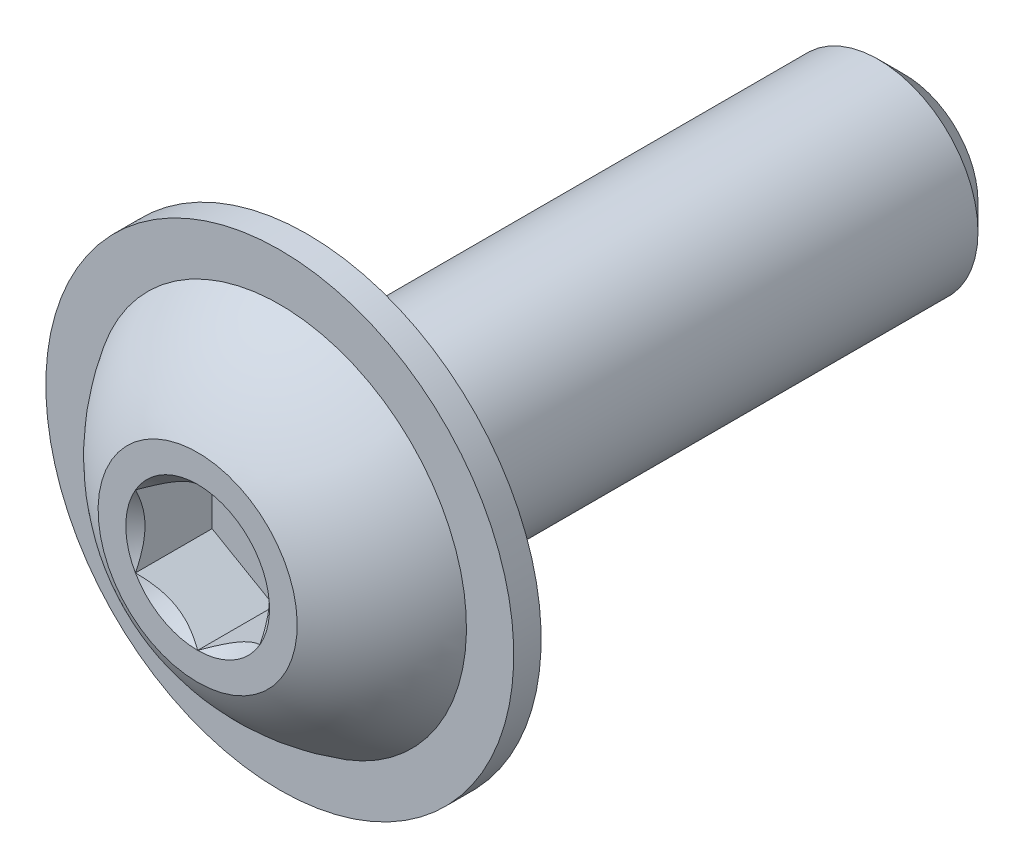
ISO-10303-21;
HEADER;
FILE_DESCRIPTION(('STEP AP214'),'2;1');
FILE_NAME('part.step','',(''),(''),'','','');
FILE_SCHEMA(('AUTOMOTIVE_DESIGN { 1 0 10303 214 1 1 1 1 }'));
ENDSEC;
DATA;
#1=APPLICATION_CONTEXT('core data for automotive mechanical design processes');
#2=APPLICATION_PROTOCOL_DEFINITION('international standard','automotive_design',2000,#1);
#3=PRODUCT_CONTEXT('',#1,'mechanical');
#4=PRODUCT('Part','Part','',(#3));
#5=PRODUCT_RELATED_PRODUCT_CATEGORY('part','',(#4));
#6=PRODUCT_DEFINITION_FORMATION('','',#4);
#7=PRODUCT_DEFINITION_CONTEXT('part definition',#1,'design');
#8=PRODUCT_DEFINITION('design','',#6,#7);
#9=PRODUCT_DEFINITION_SHAPE('','',#8);
#10=(LENGTH_UNIT() NAMED_UNIT(*) SI_UNIT(.MILLI.,.METRE.));
#11=(NAMED_UNIT(*) PLANE_ANGLE_UNIT() SI_UNIT($,.RADIAN.));
#12=(NAMED_UNIT(*) SI_UNIT($,.STERADIAN.) SOLID_ANGLE_UNIT());
#13=UNCERTAINTY_MEASURE_WITH_UNIT(LENGTH_MEASURE(1.E-05),#10,'distance_accuracy_value','');
#14=(GEOMETRIC_REPRESENTATION_CONTEXT(3) GLOBAL_UNCERTAINTY_ASSIGNED_CONTEXT((#13)) GLOBAL_UNIT_ASSIGNED_CONTEXT((#10,
#11,#12)) REPRESENTATION_CONTEXT('',''));
#15=CARTESIAN_POINT('',(0.,0.,0.));
#16=DIRECTION('',(0.,0.,1.));
#17=DIRECTION('',(1.,0.,0.));
#18=AXIS2_PLACEMENT_3D('',#15,#16,#17);
#19=CARTESIAN_POINT('',(0.,2.,-7.1));
#20=DIRECTION('',(0.,0.,1.));
#21=DIRECTION('',(1.,0.,0.));
#22=AXIS2_PLACEMENT_3D('',#19,#20,#21);
#23=PLANE('',#22);
#24=CARTESIAN_POINT('',(0.,0.,-7.1));
#25=DIRECTION('',(0.,0.,1.));
#26=DIRECTION('',(1.,0.,0.));
#27=AXIS2_PLACEMENT_3D('',#24,#25,#26);
#28=CIRCLE('',#27,1.475);
#29=CARTESIAN_POINT('',(1.475,0.,-7.1));
#30=VERTEX_POINT('',#29);
#31=EDGE_CURVE('E55',#30,#30,#28,.F.);
#32=ORIENTED_EDGE('',*,*,#31,.T.);
#33=EDGE_LOOP('',(#32));
#34=FACE_BOUND('',#33,.T.);
#35=ADVANCED_FACE('F41',(#34),#23,.F.);
#36=CARTESIAN_POINT('',(0.,0.,7.1));
#37=DIRECTION('',(0.,0.,1.));
#38=DIRECTION('',(1.,0.,0.));
#39=AXIS2_PLACEMENT_3D('',#36,#37,#38);
#40=CYLINDRICAL_SURFACE('',#39,2.);
#41=CARTESIAN_POINT('',(0.,0.,-6.575));
#42=DIRECTION('',(0.,0.,1.));
#43=DIRECTION('',(1.,0.,0.));
#44=AXIS2_PLACEMENT_3D('',#41,#42,#43);
#45=CIRCLE('',#44,2.);
#46=CARTESIAN_POINT('',(2.,0.,-6.575));
#47=VERTEX_POINT('',#46);
#48=EDGE_CURVE('E189',#47,#47,#45,.T.);
#49=ORIENTED_EDGE('',*,*,#48,.T.);
#50=EDGE_LOOP('',(#49));
#51=FACE_BOUND('',#50,.T.);
#52=CARTESIAN_POINT('',(0.,0.,4.9));
#53=DIRECTION('',(0.,0.,1.));
#54=DIRECTION('',(1.,0.,0.));
#55=AXIS2_PLACEMENT_3D('',#52,#53,#54);
#56=CIRCLE('',#55,2.);
#57=CARTESIAN_POINT('',(2.,0.,4.9));
#58=VERTEX_POINT('',#57);
#59=EDGE_CURVE('E186',#58,#58,#56,.T.);
#60=ORIENTED_EDGE('',*,*,#59,.F.);
#61=EDGE_LOOP('',(#60));
#62=FACE_BOUND('',#61,.T.);
#63=ADVANCED_FACE('F198',(#51,#62),#40,.T.);
#64=CARTESIAN_POINT('',(0.,0.,-6.575));
#65=DIRECTION('',(0.,0.,1.));
#66=DIRECTION('',(1.,0.,0.));
#67=AXIS2_PLACEMENT_3D('',#64,#65,#66);
#68=CONICAL_SURFACE('',#67,2.,0.78539816339745);
#69=ORIENTED_EDGE('',*,*,#31,.F.);
#70=EDGE_LOOP('',(#69));
#71=FACE_BOUND('',#70,.T.);
#72=ORIENTED_EDGE('',*,*,#48,.F.);
#73=EDGE_LOOP('',(#72));
#74=FACE_BOUND('',#73,.T.);
#75=ADVANCED_FACE('F43',(#71,#74),#68,.T.);
#76=CARTESIAN_POINT('',(0.,-4.7,4.9));
#77=DIRECTION('',(0.,0.,1.));
#78=DIRECTION('',(0.,-1.,0.));
#79=AXIS2_PLACEMENT_3D('',#76,#77,#78);
#80=PLANE('',#79);
#81=CARTESIAN_POINT('',(0.,0.,4.9));
#82=DIRECTION('',(0.,0.,1.));
#83=DIRECTION('',(0.,-1.,0.));
#84=AXIS2_PLACEMENT_3D('',#81,#82,#83);
#85=CIRCLE('',#84,4.7);
#86=CARTESIAN_POINT('',(0.,-4.7,4.9));
#87=VERTEX_POINT('',#86);
#88=EDGE_CURVE('E180',#87,#87,#85,.T.);
#89=ORIENTED_EDGE('',*,*,#88,.F.);
#90=EDGE_LOOP('',(#89));
#91=FACE_BOUND('',#90,.T.);
#92=ORIENTED_EDGE('',*,*,#59,.T.);
#93=EDGE_LOOP('',(#92));
#94=FACE_BOUND('',#93,.T.);
#95=ADVANCED_FACE('F197',(#91,#94),#80,.F.);
#96=CARTESIAN_POINT('',(0.,0.,3.22575757575758));
#97=DIRECTION('',(0.,0.,1.));
#98=DIRECTION('',(0.,-1.,0.));
#99=AXIS2_PLACEMENT_3D('',#96,#97,#98);
#100=SPHERICAL_SURFACE('',#99,4.36001770200532);
#101=CARTESIAN_POINT('',(0.,0.,7.1));
#102=DIRECTION('',(0.,0.,1.));
#103=DIRECTION('',(0.,-1.,0.));
#104=AXIS2_PLACEMENT_3D('',#101,#102,#103);
#105=CIRCLE('',#104,2.);
#106=CARTESIAN_POINT('',(0.,-2.,7.1));
#107=VERTEX_POINT('',#106);
#108=EDGE_CURVE('E183',#107,#107,#105,.T.);
#109=CARTESIAN_POINT('',(0.,0.,5.45));
#110=DIRECTION('',(0.,0.,1.));
#111=DIRECTION('',(0.,-1.,0.));
#112=AXIS2_PLACEMENT_3D('',#109,#110,#111);
#113=CIRCLE('',#112,3.75);
#114=CARTESIAN_POINT('',(0.,-3.75,5.45));
#115=VERTEX_POINT('',#114);
#116=EDGE_CURVE('E174',#115,#115,#113,.T.);
#117=CARTESIAN_POINT('',(0.,-2.,7.1));
#118=CARTESIAN_POINT('',(0.,-2.02255518615095,7.08835636454673));
#119=CARTESIAN_POINT('',(0.,-2.04500866871602,7.07651571852121));
#120=CARTESIAN_POINT('',(0.,-2.08970542813689,7.05244411104178));
#121=CARTESIAN_POINT('',(0.,-2.11194870499269,7.04021314958787));
#122=CARTESIAN_POINT('',(0.,-2.1562182544575,7.01536461696781));
#123=CARTESIAN_POINT('',(0.,-2.17824452706651,7.00274704580165));
#124=CARTESIAN_POINT('',(0.,-2.22207335287518,6.97712914930491));
#125=CARTESIAN_POINT('',(0.,-2.24387590607482,6.96412882397433));
#126=CARTESIAN_POINT('',(0.,-2.2872506415409,6.93774938290203));
#127=CARTESIAN_POINT('',(0.,-2.30882282380734,6.92437026716031));
#128=CARTESIAN_POINT('',(0.,-2.35173023738795,6.89723732685395));
#129=CARTESIAN_POINT('',(0.,-2.37306546870214,6.88348350228933));
#130=CARTESIAN_POINT('',(0.,-2.41549247230715,6.85560533961113));
#131=CARTESIAN_POINT('',(0.,-2.43658424459798,6.84148100149757));
#132=CARTESIAN_POINT('',(0.,-2.47851789643734,6.81286612017968));
#133=CARTESIAN_POINT('',(0.,-2.49935977598588,6.79837557697536));
#134=CARTESIAN_POINT('',(0.,-2.54078728482416,6.76903270559559));
#135=CARTESIAN_POINT('',(0.,-2.56137291411389,6.75418037742015));
#136=CARTESIAN_POINT('',(0.,-2.6022816430898,6.72411846658681));
#137=CARTESIAN_POINT('',(0.,-2.62260474277597,6.70890888392892));
#138=CARTESIAN_POINT('',(0.,-2.66298221327912,6.67813710359147));
#139=CARTESIAN_POINT('',(0.,-2.6830365840961,6.66257490591191));
#140=CARTESIAN_POINT('',(0.,-2.72287047956752,6.63110264255283));
#141=CARTESIAN_POINT('',(0.,-2.74265000422196,6.61519257687331));
#142=CARTESIAN_POINT('',(0.,-2.78192817391263,6.58302943064784));
#143=CARTESIAN_POINT('',(0.,-2.80142681894887,6.56677635010189));
#144=CARTESIAN_POINT('',(0.,-2.84013728162575,6.53393213190884));
#145=CARTESIAN_POINT('',(0.,-2.8593490992664,6.51734099426174));
#146=CARTESIAN_POINT('',(0.,-2.89748004686721,6.48382572275106));
#147=CARTESIAN_POINT('',(0.,-2.91639917682738,6.46690158888747));
#148=CARTESIAN_POINT('',(0.,-2.95393897806246,6.4327254874041));
#149=CARTESIAN_POINT('',(0.,-2.97255964933737,6.41547351978432));
#150=CARTESIAN_POINT('',(0.,-3.00949685323764,6.38064701324978));
#151=CARTESIAN_POINT('',(0.,-3.027813385863,6.36307247433502));
#152=CARTESIAN_POINT('',(0.,-3.06413672527292,6.32760618606739));
#153=CARTESIAN_POINT('',(0.,-3.08214353205748,6.30971443671452));
#154=CARTESIAN_POINT('',(0.,-3.11784192707191,6.27361918518798));
#155=CARTESIAN_POINT('',(0.,-3.13553351530178,6.2554156830143));
#156=CARTESIAN_POINT('',(0.,-3.17059607664577,6.2187024785591));
#157=CARTESIAN_POINT('',(0.,-3.18796704975989,6.20019277627757));
#158=CARTESIAN_POINT('',(0.,-3.22238308211027,6.16287281772148));
#159=CARTESIAN_POINT('',(0.,-3.23942814134652,6.14406256144692));
#160=CARTESIAN_POINT('',(0.,-3.2731871465944,6.10614723269923));
#161=CARTESIAN_POINT('',(0.,-3.28990109260602,6.08704216022611));
#162=CARTESIAN_POINT('',(0.,-3.32299277305889,6.04854302680502));
#163=CARTESIAN_POINT('',(0.,-3.33937050750014,6.02914896585706));
#164=CARTESIAN_POINT('',(0.,-3.37178476902379,5.99007777136224));
#165=CARTESIAN_POINT('',(0.,-3.38782129610619,5.97040063781539));
#166=CARTESIAN_POINT('',(0.,-3.41954825120095,5.93076930034401));
#167=CARTESIAN_POINT('',(0.,-3.4352386792133,5.91081509641949));
#168=CARTESIAN_POINT('',(0.,-3.46626865004064,5.87063570493734));
#169=CARTESIAN_POINT('',(0.,-3.48160819285563,5.85041051737971));
#170=CARTESIAN_POINT('',(0.,-3.51193171415075,5.8096953280092));
#171=CARTESIAN_POINT('',(0.,-3.52691569263089,5.78920532619633));
#172=CARTESIAN_POINT('',(0.,-3.55652351473747,5.74796675856904));
#173=CARTESIAN_POINT('',(0.,-3.57114735836392,5.72721819275461));
#174=CARTESIAN_POINT('',(0.,-3.60003044950498,5.68546882588304));
#175=CARTESIAN_POINT('',(0.,-3.61428969701958,5.6644680248259));
#176=CARTESIAN_POINT('',(0.,-3.6424392481075,5.62222059453443));
#177=CARTESIAN_POINT('',(0.,-3.65632955168082,5.60097396530011));
#178=CARTESIAN_POINT('',(0.,-3.68373697133491,5.55824135560807));
#179=CARTESIAN_POINT('',(0.,-3.69725408741568,5.53675537515035));
#180=CARTESIAN_POINT('',(0.,-3.72391103320597,5.49355063200212));
#181=CARTESIAN_POINT('',(0.,-3.73705086291548,5.4718318693116));
#182=CARTESIAN_POINT('',(0.,-3.75,5.45));
#183=B_SPLINE_CURVE_WITH_KNOTS('',3,(#117,#118,#119,#120,#121,#122,#123,#124,#125,#126,#127,
#128,#129,#130,#131,#132,#133,#134,#135,#136,#137,#138,#139,#140,#141,#142,#143,#144,#145,#146,
#147,#148,#149,#150,#151,#152,#153,#154,#155,#156,#157,#158,#159,#160,#161,#162,#163,#164,#165,
#166,#167,#168,#169,#170,#171,#172,#173,#174,#175,#176,#177,#178,#179,#180,#181,#182),
.UNSPECIFIED.,.F.,.F.,(4,2,2,2,2,2,2,2,2,2,2,2,2,2,2,2,2,2,2,2,2,2,2,2,2,2,2,2,2,2,2,2,4),(0.,
0.0761488570278908,0.152297714055781,0.228446571083672,0.304595428111562,0.380744285139453,
0.456893142167344,0.533041999195235,0.609190856223125,0.685339713251016,0.761488570278905,
0.837637427306797,0.913786284334687,0.989935141362578,1.06608399839047,1.14223285541836,
1.21838171244625,1.29453056947414,1.37067942650203,1.44682828352992,1.52297714055781,
1.5991259975857,1.67527485461359,1.75142371164149,1.82757256866938,1.90372142569727,
1.97987028272516,2.05601913975305,2.13216799678094,2.20831685380883,2.28446571083672,
2.36061456786461,2.4367634248925),.UNSPECIFIED.);
#184=EDGE_CURVE('BSEAM207',#107,#115,#183,.T.);
#185=ORIENTED_EDGE('',*,*,#108,.F.);
#186=ORIENTED_EDGE('',*,*,#116,.T.);
#187=ORIENTED_EDGE('',*,*,#184,.T.);
#188=ORIENTED_EDGE('',*,*,#184,.F.);
#189=EDGE_LOOP('',(#185,#187,#186,#188));
#190=FACE_BOUND('',#189,.T.);
#191=ADVANCED_FACE('F207',(#190),#100,.T.);
#192=CARTESIAN_POINT('',(0.,-2.,7.1));
#193=DIRECTION('',(0.,0.,-1.));
#194=DIRECTION('',(0.,1.,0.));
#195=AXIS2_PLACEMENT_3D('',#192,#193,#194);
#196=PLANE('',#195);
#197=CARTESIAN_POINT('',(0.,0.,7.1));
#198=DIRECTION('',(0.,0.,1.));
#199=DIRECTION('',(1.,0.,0.));
#200=AXIS2_PLACEMENT_3D('',#197,#198,#199);
#201=CIRCLE('',#200,1.44337567297406);
#202=CARTESIAN_POINT('',(0.,1.44337567297406,7.1));
#203=VERTEX_POINT('',#202);
#204=CARTESIAN_POINT('',(-1.25,0.721687836487032,7.1));
#205=VERTEX_POINT('',#204);
#206=EDGE_CURVE('E141',#203,#205,#201,.T.);
#207=ORIENTED_EDGE('',*,*,#206,.F.);
#208=CARTESIAN_POINT('',(1.25,0.721687836487033,7.1));
#209=VERTEX_POINT('',#208);
#210=EDGE_CURVE('E138',#209,#203,#201,.T.);
#211=ORIENTED_EDGE('',*,*,#210,.F.);
#212=CARTESIAN_POINT('',(1.25,-0.721687836487032,7.1));
#213=VERTEX_POINT('',#212);
#214=EDGE_CURVE('E108',#213,#209,#201,.T.);
#215=ORIENTED_EDGE('',*,*,#214,.F.);
#216=CARTESIAN_POINT('',(0.,-1.44337567297406,7.1));
#217=VERTEX_POINT('',#216);
#218=EDGE_CURVE('E100',#217,#213,#201,.T.);
#219=ORIENTED_EDGE('',*,*,#218,.F.);
#220=CARTESIAN_POINT('',(-1.25,-0.721687836487032,7.1));
#221=VERTEX_POINT('',#220);
#222=EDGE_CURVE('E61',#221,#217,#201,.T.);
#223=ORIENTED_EDGE('',*,*,#222,.F.);
#224=EDGE_CURVE('E68',#205,#221,#201,.T.);
#225=ORIENTED_EDGE('',*,*,#224,.F.);
#226=EDGE_LOOP('',(#207,#211,#215,#219,#223,#225));
#227=FACE_BOUND('',#226,.T.);
#228=ORIENTED_EDGE('',*,*,#108,.T.);
#229=EDGE_LOOP('',(#228));
#230=FACE_BOUND('',#229,.T.);
#231=ADVANCED_FACE('F135',(#227,#230),#196,.F.);
#232=CARTESIAN_POINT('',(0.,0.,7.1));
#233=DIRECTION('',(0.,0.,1.));
#234=DIRECTION('',(0.,-1.,0.));
#235=AXIS2_PLACEMENT_3D('',#232,#233,#234);
#236=CYLINDRICAL_SURFACE('',#235,4.7);
#237=CARTESIAN_POINT('',(0.,0.,5.45));
#238=DIRECTION('',(0.,0.,1.));
#239=DIRECTION('',(0.,-1.,0.));
#240=AXIS2_PLACEMENT_3D('',#237,#238,#239);
#241=CIRCLE('',#240,4.7);
#242=CARTESIAN_POINT('',(0.,-4.7,5.45));
#243=VERTEX_POINT('',#242);
#244=EDGE_CURVE('E177',#243,#243,#241,.T.);
#245=ORIENTED_EDGE('',*,*,#244,.F.);
#246=EDGE_LOOP('',(#245));
#247=FACE_BOUND('',#246,.T.);
#248=ORIENTED_EDGE('',*,*,#88,.T.);
#249=EDGE_LOOP('',(#248));
#250=FACE_BOUND('',#249,.T.);
#251=ADVANCED_FACE('F222',(#247,#250),#236,.T.);
#252=CARTESIAN_POINT('',(0.,-3.75,5.45));
#253=DIRECTION('',(0.,0.,-1.));
#254=DIRECTION('',(0.,1.,0.));
#255=AXIS2_PLACEMENT_3D('',#252,#253,#254);
#256=PLANE('',#255);
#257=ORIENTED_EDGE('',*,*,#116,.F.);
#258=EDGE_LOOP('',(#257));
#259=FACE_BOUND('',#258,.T.);
#260=ORIENTED_EDGE('',*,*,#244,.T.);
#261=EDGE_LOOP('',(#260));
#262=FACE_BOUND('',#261,.T.);
#263=ADVANCED_FACE('F228',(#259,#262),#256,.F.);
#264=CARTESIAN_POINT('',(0.,0.,7.1));
#265=DIRECTION('',(0.,0.,1.));
#266=DIRECTION('',(1.,0.,0.));
#267=AXIS2_PLACEMENT_3D('',#264,#265,#266);
#268=CONICAL_SURFACE('',#267,1.44337567297406,0.78539816339745);
#269=ORIENTED_EDGE('',*,*,#214,.T.);
#270=CARTESIAN_POINT('',(1.25,-1.43934010808077,7.56298209689233));
#271=CARTESIAN_POINT('',(1.25,-1.40429313005658,7.53652492263289));
#272=CARTESIAN_POINT('',(1.25,-1.36905087135599,7.51032716035428));
#273=CARTESIAN_POINT('',(1.25,-1.29809650706311,7.45855757183958));
#274=CARTESIAN_POINT('',(1.25,-1.26238428576495,7.43298590435629));
#275=CARTESIAN_POINT('',(1.25,-1.15390111792708,7.35700599368946));
#276=CARTESIAN_POINT('',(1.25,-1.08031646726264,7.30774028618957));
#277=CARTESIAN_POINT('',(1.25,-0.926012322755093,7.21102583026313));
#278=CARTESIAN_POINT('',(1.25,-0.845125318656145,7.16384129894179));
#279=CARTESIAN_POINT('',(1.25,-0.679311174076601,7.07753073439041));
#280=CARTESIAN_POINT('',(1.25,-0.594398891026686,7.0383775346269));
#281=CARTESIAN_POINT('',(1.25,-0.466944812460739,6.99047722368829));
#282=CARTESIAN_POINT('',(1.25,-0.42628998581282,6.97672948978633));
#283=CARTESIAN_POINT('',(1.25,-0.343998850091266,6.95249792745054));
#284=CARTESIAN_POINT('',(1.25,-0.302362473614961,6.94201432386977));
#285=CARTESIAN_POINT('',(1.25,-0.219052696285664,6.9250301617483));
#286=CARTESIAN_POINT('',(1.25,-0.177393428474498,6.91846136047137));
#287=CARTESIAN_POINT('',(1.25,-0.0936293693401908,6.90943505345776));
#288=CARTESIAN_POINT('',(1.25,-0.0515246558543946,6.90697684099727));
#289=CARTESIAN_POINT('',(1.25,0.031189057630633,6.90635406201328));
#290=CARTESIAN_POINT('',(1.25,0.0717969625499318,6.90803711684625));
#291=CARTESIAN_POINT('',(1.25,0.152668636885198,6.91526827059791));
#292=CARTESIAN_POINT('',(1.25,0.192932338835359,6.92081711041311));
#293=CARTESIAN_POINT('',(1.25,0.273499879165297,6.93557103646495));
#294=CARTESIAN_POINT('',(1.25,0.313792180618512,6.9448381759641));
#295=CARTESIAN_POINT('',(1.25,0.393496413911459,6.96653617845735));
#296=CARTESIAN_POINT('',(1.25,0.43290841911506,6.97896677673064));
#297=CARTESIAN_POINT('',(1.25,0.5569927358623,7.02277935293144));
#298=CARTESIAN_POINT('',(1.25,0.639898924666087,7.05915107287596));
#299=CARTESIAN_POINT('',(1.25,0.801816555499704,7.14001916217834));
#300=CARTESIAN_POINT('',(1.25,0.880812666325047,7.18454472091199));
#301=CARTESIAN_POINT('',(1.25,1.0317856127975,7.27640487666662));
#302=CARTESIAN_POINT('',(1.25,1.10391618485086,7.32348993391625));
#303=CARTESIAN_POINT('',(1.25,1.21018606043311,7.39627856159854));
#304=CARTESIAN_POINT('',(1.25,1.2451506996938,7.42079808539336));
#305=CARTESIAN_POINT('',(1.25,1.31460220852737,7.47048563676568));
#306=CARTESIAN_POINT('',(1.25,1.34908920596618,7.49565348541552));
#307=CARTESIAN_POINT('',(1.25,1.38337731682912,7.52109014884121));
#308=B_SPLINE_CURVE_WITH_KNOTS('',3,(#270,#271,#272,#273,#274,#275,#276,#277,#278,#279,#280,
#281,#282,#283,#284,#285,#286,#287,#288,#289,#290,#291,#292,#293,#294,#295,#296,#297,#298,#299,
#300,#301,#302,#303,#304,#305,#306,#307),.UNSPECIFIED.,.F.,.F.,(4,2,2,2,2,2,2,2,2,2,2,2,2,2,2,2,
2,2,4),(0.,0.131732960381448,0.263498984161645,0.529042014455825,0.809741926134618,
1.08947609717225,1.21811634272576,1.346765447839,1.47310084517844,1.59941451973784,
1.72115042167849,1.84290966131735,1.96679153905342,2.09066305366039,2.36146692896009,
2.63325989198491,2.89154668212279,3.01965734507713,3.14773302245628),.UNSPECIFIED.);
#309=EDGE_CURVE('E11',#213,#209,#308,.T.);
#310=ORIENTED_EDGE('',*,*,#309,.F.);
#311=EDGE_LOOP('',(#269,#310));
#312=FACE_BOUND('',#311,.T.);
#313=ADVANCED_FACE('F112',(#312),#268,.F.);
#314=ORIENTED_EDGE('',*,*,#210,.T.);
#315=CARTESIAN_POINT('',(1.2502,0.721572366433195,7.10011548390914));
#316=CARTESIAN_POINT('',(1.20722483292841,0.746384090710445,7.0753216680551));
#317=CARTESIAN_POINT('',(1.16353099525405,0.771610739653665,7.05198373441868));
#318=CARTESIAN_POINT('',(1.07443406915806,0.823050873919155,7.00925200408454));
#319=CARTESIAN_POINT('',(1.02902250164294,0.849269254648334,6.98988199236041));
#320=CARTESIAN_POINT('',(0.937452179064739,0.902137405038636,6.95670048341348));
#321=CARTESIAN_POINT('',(0.891316759824113,0.928773701756388,6.94280555905265));
#322=CARTESIAN_POINT('',(0.798029919592407,0.982632884076013,6.92139728216064));
#323=CARTESIAN_POINT('',(0.750881350863619,1.00985412292348,6.91386794156679));
#324=CARTESIAN_POINT('',(0.669626443112747,1.05676666578643,6.9070744980507));
#325=CARTESIAN_POINT('',(0.635625123372058,1.07639733689152,6.90606855910435));
#326=CARTESIAN_POINT('',(0.567682235567521,1.11562418145499,6.90776141491132));
#327=CARTESIAN_POINT('',(0.533740682344341,1.1352203463451,6.91046102721554));
#328=CARTESIAN_POINT('',(0.466185143542499,1.1742235548576,6.91940893031638));
#329=CARTESIAN_POINT('',(0.432571492713224,1.19363040521233,6.92566052589971));
#330=CARTESIAN_POINT('',(0.365905361782186,1.23212011385119,6.9413756814139));
#331=CARTESIAN_POINT('',(0.332853128969703,1.2512028293628,6.95084062008746));
#332=CARTESIAN_POINT('',(0.248200308399735,1.30007715810653,6.97893139068759));
#333=CARTESIAN_POINT('',(0.197133507570361,1.32956058931202,6.9996701574522));
#334=CARTESIAN_POINT('',(0.0969991458867445,1.38737318998519,7.04638713467148));
#335=CARTESIAN_POINT('',(0.04792568842173,1.41570576386268,7.07234829594677));
#336=CARTESIAN_POINT('',(-0.000200000000000338,1.4434911430279,7.10011548390914));
#337=B_SPLINE_CURVE_WITH_KNOTS('',3,(#315,#316,#317,#318,#319,#320,#321,#322,#323,#324,#325,
#326,#327,#328,#329,#330,#331,#332,#333,#334,#335,#336),.UNSPECIFIED.,.F.,.F.,(4,2,2,2,2,2,2,2,
2,2,4),(0.,0.166533409618304,0.334037607289762,0.498880396489698,0.663307919240275,
0.780963963458827,0.898645970148453,1.01643764860773,1.1342799317155,1.32148652032141,
1.50809158792573),.UNSPECIFIED.);
#338=EDGE_CURVE('E140',#209,#203,#337,.T.);
#339=ORIENTED_EDGE('',*,*,#338,.F.);
#340=EDGE_LOOP('',(#314,#339));
#341=FACE_BOUND('',#340,.T.);
#342=ADVANCED_FACE('F310',(#341),#268,.F.);
#343=ORIENTED_EDGE('',*,*,#206,.T.);
#344=CARTESIAN_POINT('',(0.000199999999999798,1.4434911430279,7.10011548390914));
#345=CARTESIAN_POINT('',(-0.0427751670715869,1.41867941875065,7.0753216680551));
#346=CARTESIAN_POINT('',(-0.0864690047459482,1.39345276980743,7.05198373441868));
#347=CARTESIAN_POINT('',(-0.175565930841942,1.34201263554194,7.00925200408454));
#348=CARTESIAN_POINT('',(-0.220977498357064,1.31579425481276,6.98988199236041));
#349=CARTESIAN_POINT('',(-0.31254782093526,1.26292610442246,6.95670048341348));
#350=CARTESIAN_POINT('',(-0.358683240175886,1.23628980770471,6.94280555905265));
#351=CARTESIAN_POINT('',(-0.451970080407592,1.18243062538508,6.92139728216064));
#352=CARTESIAN_POINT('',(-0.49911864913638,1.15520938653761,6.91386794156679));
#353=CARTESIAN_POINT('',(-0.580373556887252,1.10829684367467,6.9070744980507));
#354=CARTESIAN_POINT('',(-0.614374876627941,1.08866617256958,6.90606855910435));
#355=CARTESIAN_POINT('',(-0.682317764432477,1.04943932800611,6.90776141491132));
#356=CARTESIAN_POINT('',(-0.716259317655657,1.02984316311599,6.91046102721554));
#357=CARTESIAN_POINT('',(-0.783814856457499,0.990839954603499,6.91940893031638));
#358=CARTESIAN_POINT('',(-0.817428507286774,0.971433104248771,6.9256605258997));
#359=CARTESIAN_POINT('',(-0.884094638217813,0.932943395609905,6.9413756814139));
#360=CARTESIAN_POINT('',(-0.917146871030295,0.9138606800983,6.95084062008746));
#361=CARTESIAN_POINT('',(-1.00179969160026,0.864986351354568,6.97893139068758));
#362=CARTESIAN_POINT('',(-1.05286649242964,0.835502920149076,6.9996701574522));
#363=CARTESIAN_POINT('',(-1.15300085411325,0.777690319475909,7.04638713467148));
#364=CARTESIAN_POINT('',(-1.20207431157827,0.749357745598417,7.07234829594677));
#365=CARTESIAN_POINT('',(-1.2502,0.721572366433194,7.10011548390913));
#366=B_SPLINE_CURVE_WITH_KNOTS('',3,(#344,#345,#346,#347,#348,#349,#350,#351,#352,#353,#354,
#355,#356,#357,#358,#359,#360,#361,#362,#363,#364,#365),.UNSPECIFIED.,.F.,.F.,(4,2,2,2,2,2,2,2,
2,2,4),(0.,0.166533409618303,0.334037607289762,0.498880396489698,0.663307919240274,
0.780963963458826,0.898645970148452,1.01643764860773,1.13427993171549,1.32148652032141,
1.50809158792573),.UNSPECIFIED.);
#367=EDGE_CURVE('E144',#203,#205,#366,.T.);
#368=ORIENTED_EDGE('',*,*,#367,.F.);
#369=EDGE_LOOP('',(#343,#368));
#370=FACE_BOUND('',#369,.T.);
#371=ADVANCED_FACE('F147',(#370),#268,.F.);
#372=ORIENTED_EDGE('',*,*,#224,.T.);
#373=CARTESIAN_POINT('',(-1.25,-1.43934010808077,7.56298209689233));
#374=CARTESIAN_POINT('',(-1.25,-1.40429313005659,7.53652492263289));
#375=CARTESIAN_POINT('',(-1.25,-1.36905087135599,7.51032716035428));
#376=CARTESIAN_POINT('',(-1.25,-1.29809650706311,7.45855757183958));
#377=CARTESIAN_POINT('',(-1.25,-1.26238428576495,7.43298590435629));
#378=CARTESIAN_POINT('',(-1.25,-1.15390111792708,7.35700599368946));
#379=CARTESIAN_POINT('',(-1.25,-1.08031646726264,7.30774028618957));
#380=CARTESIAN_POINT('',(-1.25,-0.926012322755096,7.21102583026313));
#381=CARTESIAN_POINT('',(-1.25,-0.845125318656147,7.1638412989418));
#382=CARTESIAN_POINT('',(-1.25,-0.679311174076602,7.07753073439041));
#383=CARTESIAN_POINT('',(-1.25,-0.594398891026687,7.0383775346269));
#384=CARTESIAN_POINT('',(-1.25,-0.46694481246074,6.99047722368829));
#385=CARTESIAN_POINT('',(-1.25,-0.426289985812821,6.97672948978634));
#386=CARTESIAN_POINT('',(-1.25,-0.343998850091267,6.95249792745054));
#387=CARTESIAN_POINT('',(-1.25,-0.302362473614961,6.94201432386977));
#388=CARTESIAN_POINT('',(-1.25,-0.219052696285664,6.9250301617483));
#389=CARTESIAN_POINT('',(-1.25,-0.177393428474499,6.91846136047137));
#390=CARTESIAN_POINT('',(-1.25,-0.0936293693401909,6.90943505345776));
#391=CARTESIAN_POINT('',(-1.25,-0.0515246558543946,6.90697684099727));
#392=CARTESIAN_POINT('',(-1.25,0.0311890576306329,6.90635406201328));
#393=CARTESIAN_POINT('',(-1.25,0.0717969625499317,6.90803711684625));
#394=CARTESIAN_POINT('',(-1.25,0.152668636885198,6.91526827059791));
#395=CARTESIAN_POINT('',(-1.25,0.192932338835359,6.92081711041311));
#396=CARTESIAN_POINT('',(-1.25,0.273499879165297,6.93557103646495));
#397=CARTESIAN_POINT('',(-1.25,0.313792180618512,6.9448381759641));
#398=CARTESIAN_POINT('',(-1.25,0.393496413911459,6.96653617845735));
#399=CARTESIAN_POINT('',(-1.25,0.43290841911506,6.97896677673064));
#400=CARTESIAN_POINT('',(-1.25,0.5569927358623,7.02277935293144));
#401=CARTESIAN_POINT('',(-1.25,0.639898924666087,7.05915107287596));
#402=CARTESIAN_POINT('',(-1.25,0.801816555499704,7.14001916217834));
#403=CARTESIAN_POINT('',(-1.25,0.880812666325047,7.18454472091199));
#404=CARTESIAN_POINT('',(-1.25,1.0317856127975,7.27640487666662));
#405=CARTESIAN_POINT('',(-1.25,1.10391618485086,7.32348993391625));
#406=CARTESIAN_POINT('',(-1.25,1.21018606043311,7.39627856159854));
#407=CARTESIAN_POINT('',(-1.25,1.2451506996938,7.42079808539336));
#408=CARTESIAN_POINT('',(-1.25,1.31460220852737,7.47048563676568));
#409=CARTESIAN_POINT('',(-1.25,1.34908920596618,7.49565348541552));
#410=CARTESIAN_POINT('',(-1.25,1.38337731682912,7.52109014884121));
#411=B_SPLINE_CURVE_WITH_KNOTS('',3,(#373,#374,#375,#376,#377,#378,#379,#380,#381,#382,#383,
#384,#385,#386,#387,#388,#389,#390,#391,#392,#393,#394,#395,#396,#397,#398,#399,#400,#401,#402,
#403,#404,#405,#406,#407,#408,#409,#410),.UNSPECIFIED.,.F.,.F.,(4,2,2,2,2,2,2,2,2,2,2,2,2,2,2,2,
2,2,4),(0.,0.131732960381448,0.263498984161644,0.529042014455825,0.809741926134618,
1.08947609717225,1.21811634272577,1.34676544783901,1.47310084517844,1.59941451973785,
1.7211504216785,1.84290966131735,1.96679153905342,2.09066305366039,2.36146692896009,
2.63325989198491,2.89154668212279,3.01965734507713,3.14773302245628),.UNSPECIFIED.);
#412=EDGE_CURVE('E150',#205,#221,#411,.F.);
#413=ORIENTED_EDGE('',*,*,#412,.F.);
#414=EDGE_LOOP('',(#372,#413));
#415=FACE_BOUND('',#414,.T.);
#416=ADVANCED_FACE('F151',(#415),#268,.F.);
#417=ORIENTED_EDGE('',*,*,#222,.T.);
#418=CARTESIAN_POINT('',(-1.2502,-0.721572366433193,7.10011548390914));
#419=CARTESIAN_POINT('',(-1.20722483292841,-0.746384090710443,7.0753216680551));
#420=CARTESIAN_POINT('',(-1.16353099525405,-0.771610739653663,7.05198373441868));
#421=CARTESIAN_POINT('',(-1.07443406915806,-0.823050873919154,7.00925200408454));
#422=CARTESIAN_POINT('',(-1.02902250164294,-0.849269254648332,6.98988199236041));
#423=CARTESIAN_POINT('',(-0.93745217906474,-0.902137405038634,6.95670048341348));
#424=CARTESIAN_POINT('',(-0.891316759824114,-0.928773701756386,6.94280555905265));
#425=CARTESIAN_POINT('',(-0.798029919592407,-0.982632884076011,6.92139728216064));
#426=CARTESIAN_POINT('',(-0.75088135086362,-1.00985412292348,6.91386794156679));
#427=CARTESIAN_POINT('',(-0.669626443112747,-1.05676666578643,6.9070744980507));
#428=CARTESIAN_POINT('',(-0.635625123372059,-1.07639733689152,6.90606855910435));
#429=CARTESIAN_POINT('',(-0.567682235567522,-1.11562418145499,6.90776141491132));
#430=CARTESIAN_POINT('',(-0.533740682344342,-1.1352203463451,6.91046102721554));
#431=CARTESIAN_POINT('',(-0.4661851435425,-1.1742235548576,6.91940893031638));
#432=CARTESIAN_POINT('',(-0.432571492713225,-1.19363040521232,6.9256605258997));
#433=CARTESIAN_POINT('',(-0.365905361782187,-1.23212011385119,6.9413756814139));
#434=CARTESIAN_POINT('',(-0.332853128969705,-1.2512028293628,6.95084062008746));
#435=CARTESIAN_POINT('',(-0.248200308399736,-1.30007715810653,6.97893139068759));
#436=CARTESIAN_POINT('',(-0.197133507570362,-1.32956058931202,6.9996701574522));
#437=CARTESIAN_POINT('',(-0.0969991458867453,-1.38737318998519,7.04638713467148));
#438=CARTESIAN_POINT('',(-0.0479256884217306,-1.41570576386268,7.07234829594677));
#439=CARTESIAN_POINT('',(0.000199999999999983,-1.4434911430279,7.10011548390914));
#440=B_SPLINE_CURVE_WITH_KNOTS('',3,(#418,#419,#420,#421,#422,#423,#424,#425,#426,#427,#428,
#429,#430,#431,#432,#433,#434,#435,#436,#437,#438,#439),.UNSPECIFIED.,.F.,.F.,(4,2,2,2,2,2,2,2,
2,2,4),(0.,0.166533409618303,0.334037607289762,0.498880396489698,0.663307919240274,
0.780963963458826,0.898645970148452,1.01643764860773,1.13427993171549,1.32148652032141,
1.50809158792574),.UNSPECIFIED.);
#441=EDGE_CURVE('E124',#221,#217,#440,.T.);
#442=ORIENTED_EDGE('',*,*,#441,.F.);
#443=EDGE_LOOP('',(#417,#442));
#444=FACE_BOUND('',#443,.T.);
#445=ADVANCED_FACE('F259',(#444),#268,.F.);
#446=ORIENTED_EDGE('',*,*,#218,.T.);
#447=CARTESIAN_POINT('',(-0.000200000000000009,-1.4434911430279,7.10011548390914));
#448=CARTESIAN_POINT('',(0.0427751670715868,-1.41867941875065,7.0753216680551));
#449=CARTESIAN_POINT('',(0.086469004745948,-1.39345276980743,7.05198373441868));
#450=CARTESIAN_POINT('',(0.175565930841942,-1.34201263554194,7.00925200408454));
#451=CARTESIAN_POINT('',(0.220977498357064,-1.31579425481276,6.98988199236041));
#452=CARTESIAN_POINT('',(0.31254782093526,-1.26292610442246,6.95670048341348));
#453=CARTESIAN_POINT('',(0.358683240175886,-1.23628980770471,6.94280555905265));
#454=CARTESIAN_POINT('',(0.451970080407593,-1.18243062538508,6.92139728216064));
#455=CARTESIAN_POINT('',(0.49911864913638,-1.15520938653761,6.91386794156679));
#456=CARTESIAN_POINT('',(0.580373556887253,-1.10829684367467,6.9070744980507));
#457=CARTESIAN_POINT('',(0.614374876627941,-1.08866617256958,6.90606855910435));
#458=CARTESIAN_POINT('',(0.682317764432478,-1.04943932800611,6.90776141491132));
#459=CARTESIAN_POINT('',(0.716259317655658,-1.02984316311599,6.91046102721554));
#460=CARTESIAN_POINT('',(0.7838148564575,-0.990839954603497,6.91940893031638));
#461=CARTESIAN_POINT('',(0.817428507286775,-0.971433104248769,6.9256605258997));
#462=CARTESIAN_POINT('',(0.884094638217813,-0.932943395609903,6.9413756814139));
#463=CARTESIAN_POINT('',(0.917146871030296,-0.913860680098298,6.95084062008746));
#464=CARTESIAN_POINT('',(1.00179969160026,-0.864986351354566,6.97893139068758));
#465=CARTESIAN_POINT('',(1.05286649242964,-0.835502920149074,6.9996701574522));
#466=CARTESIAN_POINT('',(1.15300085411325,-0.777690319475907,7.04638713467148));
#467=CARTESIAN_POINT('',(1.20207431157827,-0.749357745598415,7.07234829594676));
#468=CARTESIAN_POINT('',(1.2502,-0.721572366433193,7.10011548390913));
#469=B_SPLINE_CURVE_WITH_KNOTS('',3,(#447,#448,#449,#450,#451,#452,#453,#454,#455,#456,#457,
#458,#459,#460,#461,#462,#463,#464,#465,#466,#467,#468),.UNSPECIFIED.,.F.,.F.,(4,2,2,2,2,2,2,2,
2,2,4),(0.,0.166533409618304,0.334037607289762,0.498880396489698,0.663307919240275,
0.780963963458827,0.898645970148453,1.01643764860773,1.1342799317155,1.32148652032141,
1.50809158792573),.UNSPECIFIED.);
#470=EDGE_CURVE('E104',#217,#213,#469,.T.);
#471=ORIENTED_EDGE('',*,*,#470,.F.);
#472=EDGE_LOOP('',(#446,#471));
#473=FACE_BOUND('',#472,.T.);
#474=ADVANCED_FACE('F102',(#473),#268,.F.);
#475=CARTESIAN_POINT('',(1.25,-0.72168783648703,5.56));
#476=DIRECTION('',(0.,0.,1.));
#477=DIRECTION('',(1.,0.,0.));
#478=AXIS2_PLACEMENT_3D('',#475,#476,#477);
#479=PLANE('',#478);
#480=DIRECTION('',(0.866025403784438,0.5,0.));
#481=VECTOR('',#480,1.);
#482=CARTESIAN_POINT('',(0.,-1.44337567297406,5.56));
#483=LINE('',#482,#481);
#484=CARTESIAN_POINT('',(0.,-1.44337567297406,5.56));
#485=VERTEX_POINT('',#484);
#486=CARTESIAN_POINT('',(1.25,-0.721687836487031,5.56));
#487=VERTEX_POINT('',#486);
#488=EDGE_CURVE('E123',#485,#487,#483,.T.);
#489=ORIENTED_EDGE('',*,*,#488,.T.);
#490=DIRECTION('',(0.,1.,0.));
#491=VECTOR('',#490,1.);
#492=CARTESIAN_POINT('',(1.25,-0.721687836487031,5.56));
#493=LINE('',#492,#491);
#494=CARTESIAN_POINT('',(1.25,0.721687836487033,5.56));
#495=VERTEX_POINT('',#494);
#496=EDGE_CURVE('E128',#487,#495,#493,.T.);
#497=ORIENTED_EDGE('',*,*,#496,.T.);
#498=DIRECTION('',(-0.866025403784439,0.5,0.));
#499=VECTOR('',#498,1.);
#500=CARTESIAN_POINT('',(1.25,0.721687836487033,5.56));
#501=LINE('',#500,#499);
#502=CARTESIAN_POINT('',(0.,1.44337567297406,5.56));
#503=VERTEX_POINT('',#502);
#504=EDGE_CURVE('E293',#495,#503,#501,.T.);
#505=ORIENTED_EDGE('',*,*,#504,.T.);
#506=DIRECTION('',(-0.866025403784438,-0.5,0.));
#507=VECTOR('',#506,1.);
#508=CARTESIAN_POINT('',(0.,1.44337567297406,5.56));
#509=LINE('',#508,#507);
#510=CARTESIAN_POINT('',(-1.25,0.721687836487032,5.56));
#511=VERTEX_POINT('',#510);
#512=EDGE_CURVE('E295',#503,#511,#509,.T.);
#513=ORIENTED_EDGE('',*,*,#512,.T.);
#514=DIRECTION('',(0.,-1.,0.));
#515=VECTOR('',#514,1.);
#516=CARTESIAN_POINT('',(-1.25,0.721687836487032,5.56));
#517=LINE('',#516,#515);
#518=CARTESIAN_POINT('',(-1.25,-0.721687836487031,5.56));
#519=VERTEX_POINT('',#518);
#520=EDGE_CURVE('E165',#511,#519,#517,.T.);
#521=ORIENTED_EDGE('',*,*,#520,.T.);
#522=DIRECTION('',(0.866025403784439,-0.5,0.));
#523=VECTOR('',#522,1.);
#524=CARTESIAN_POINT('',(-1.25,-0.721687836487031,5.56));
#525=LINE('',#524,#523);
#526=EDGE_CURVE('E131',#519,#485,#525,.T.);
#527=ORIENTED_EDGE('',*,*,#526,.T.);
#528=EDGE_LOOP('',(#489,#497,#505,#513,#521,#527));
#529=FACE_BOUND('',#528,.T.);
#530=ADVANCED_FACE('F258',(#529),#479,.T.);
#531=CARTESIAN_POINT('',(1.25,-0.721687836487031,5.56));
#532=DIRECTION('',(1.,0.,0.));
#533=DIRECTION('',(0.,0.,-1.));
#534=AXIS2_PLACEMENT_3D('',#531,#532,#533);
#535=PLANE('',#534);
#536=DIRECTION('',(0.,0.,1.));
#537=VECTOR('',#536,1.);
#538=CARTESIAN_POINT('',(1.25,-0.721687836487031,5.56));
#539=LINE('',#538,#537);
#540=EDGE_CURVE('E120',#487,#213,#539,.T.);
#541=ORIENTED_EDGE('',*,*,#540,.T.);
#542=ORIENTED_EDGE('',*,*,#309,.T.);
#543=DIRECTION('',(0.,0.,1.));
#544=VECTOR('',#543,1.);
#545=CARTESIAN_POINT('',(1.25,0.721687836487033,5.56));
#546=LINE('',#545,#544);
#547=EDGE_CURVE('E130',#495,#209,#546,.T.);
#548=ORIENTED_EDGE('',*,*,#547,.F.);
#549=ORIENTED_EDGE('',*,*,#496,.F.);
#550=EDGE_LOOP('',(#541,#542,#548,#549));
#551=FACE_BOUND('',#550,.T.);
#552=ADVANCED_FACE('F126',(#551),#535,.F.);
#553=CARTESIAN_POINT('',(1.25,0.721687836487033,5.56));
#554=DIRECTION('',(0.5,0.866025403784439,0.));
#555=DIRECTION('',(-0.866025403784439,0.5,0.));
#556=AXIS2_PLACEMENT_3D('',#553,#554,#555);
#557=PLANE('',#556);
#558=ORIENTED_EDGE('',*,*,#547,.T.);
#559=ORIENTED_EDGE('',*,*,#338,.T.);
#560=DIRECTION('',(0.,0.,1.));
#561=VECTOR('',#560,1.);
#562=CARTESIAN_POINT('',(0.,1.44337567297406,5.56));
#563=LINE('',#562,#561);
#564=EDGE_CURVE('E161',#503,#203,#563,.T.);
#565=ORIENTED_EDGE('',*,*,#564,.F.);
#566=ORIENTED_EDGE('',*,*,#504,.F.);
#567=EDGE_LOOP('',(#558,#559,#565,#566));
#568=FACE_BOUND('',#567,.T.);
#569=ADVANCED_FACE('F284',(#568),#557,.F.);
#570=CARTESIAN_POINT('',(0.,1.44337567297406,5.56));
#571=DIRECTION('',(-0.5,0.866025403784438,0.));
#572=DIRECTION('',(-0.866025403784439,-0.5,0.));
#573=AXIS2_PLACEMENT_3D('',#570,#571,#572);
#574=PLANE('',#573);
#575=ORIENTED_EDGE('',*,*,#564,.T.);
#576=ORIENTED_EDGE('',*,*,#367,.T.);
#577=DIRECTION('',(0.,0.,1.));
#578=VECTOR('',#577,1.);
#579=CARTESIAN_POINT('',(-1.25,0.721687836487032,5.56));
#580=LINE('',#579,#578);
#581=EDGE_CURVE('E159',#511,#205,#580,.T.);
#582=ORIENTED_EDGE('',*,*,#581,.F.);
#583=ORIENTED_EDGE('',*,*,#512,.F.);
#584=EDGE_LOOP('',(#575,#576,#582,#583));
#585=FACE_BOUND('',#584,.T.);
#586=ADVANCED_FACE('F157',(#585),#574,.F.);
#587=CARTESIAN_POINT('',(-1.25,0.721687836487032,5.56));
#588=DIRECTION('',(-1.,0.,0.));
#589=DIRECTION('',(0.,0.,1.));
#590=AXIS2_PLACEMENT_3D('',#587,#588,#589);
#591=PLANE('',#590);
#592=ORIENTED_EDGE('',*,*,#581,.T.);
#593=ORIENTED_EDGE('',*,*,#412,.T.);
#594=DIRECTION('',(0.,0.,1.));
#595=VECTOR('',#594,1.);
#596=CARTESIAN_POINT('',(-1.25,-0.721687836487031,5.56));
#597=LINE('',#596,#595);
#598=EDGE_CURVE('E167',#519,#221,#597,.T.);
#599=ORIENTED_EDGE('',*,*,#598,.F.);
#600=ORIENTED_EDGE('',*,*,#520,.F.);
#601=EDGE_LOOP('',(#592,#593,#599,#600));
#602=FACE_BOUND('',#601,.T.);
#603=ADVANCED_FACE('F163',(#602),#591,.F.);
#604=CARTESIAN_POINT('',(-1.25,-0.721687836487031,5.56));
#605=DIRECTION('',(-0.5,-0.866025403784438,0.));
#606=DIRECTION('',(0.866025403784439,-0.5,0.));
#607=AXIS2_PLACEMENT_3D('',#604,#605,#606);
#608=PLANE('',#607);
#609=ORIENTED_EDGE('',*,*,#598,.T.);
#610=ORIENTED_EDGE('',*,*,#441,.T.);
#611=DIRECTION('',(0.,0.,1.));
#612=VECTOR('',#611,1.);
#613=CARTESIAN_POINT('',(0.,-1.44337567297406,5.56));
#614=LINE('',#613,#612);
#615=EDGE_CURVE('E122',#485,#217,#614,.T.);
#616=ORIENTED_EDGE('',*,*,#615,.F.);
#617=ORIENTED_EDGE('',*,*,#526,.F.);
#618=EDGE_LOOP('',(#609,#610,#616,#617));
#619=FACE_BOUND('',#618,.T.);
#620=ADVANCED_FACE('F240',(#619),#608,.F.);
#621=CARTESIAN_POINT('',(0.,-1.44337567297406,5.56));
#622=DIRECTION('',(0.5,-0.866025403784438,0.));
#623=DIRECTION('',(0.866025403784439,0.5,0.));
#624=AXIS2_PLACEMENT_3D('',#621,#622,#623);
#625=PLANE('',#624);
#626=ORIENTED_EDGE('',*,*,#615,.T.);
#627=ORIENTED_EDGE('',*,*,#470,.T.);
#628=ORIENTED_EDGE('',*,*,#540,.F.);
#629=ORIENTED_EDGE('',*,*,#488,.F.);
#630=EDGE_LOOP('',(#626,#627,#628,#629));
#631=FACE_BOUND('',#630,.T.);
#632=ADVANCED_FACE('F118',(#631),#625,.F.);
#633=CLOSED_SHELL('',(#35,#63,#75,#95,#191,#231,#251,#263,#313,#342,#371,#416,#445,#474,#530,
#552,#569,#586,#603,#620,#632));
#634=MANIFOLD_SOLID_BREP('B2',#633);
#635=ADVANCED_BREP_SHAPE_REPRESENTATION('',(#18,#634),#14);
#636=SHAPE_DEFINITION_REPRESENTATION(#9,#635);
ENDSEC;
END-ISO-10303-21;
